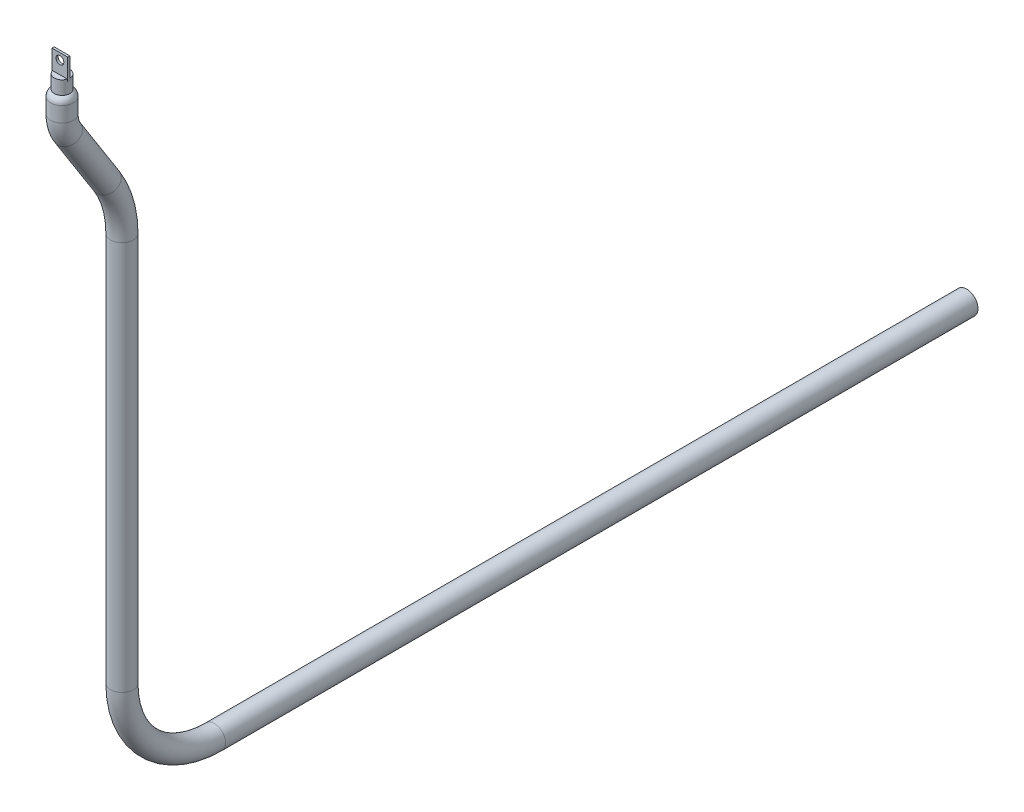
ISO-10303-21;
HEADER;
FILE_DESCRIPTION(('STEP AP214'),'2;1');
FILE_NAME('part.step','',(''),(''),'','','');
FILE_SCHEMA(('AUTOMOTIVE_DESIGN { 1 0 10303 214 1 1 1 1 }'));
ENDSEC;
DATA;
#1=APPLICATION_CONTEXT('core data for automotive mechanical design processes');
#2=APPLICATION_PROTOCOL_DEFINITION('international standard','automotive_design',2000,#1);
#3=PRODUCT_CONTEXT('',#1,'mechanical');
#4=PRODUCT('Part','Part','',(#3));
#5=PRODUCT_RELATED_PRODUCT_CATEGORY('part','',(#4));
#6=PRODUCT_DEFINITION_FORMATION('','',#4);
#7=PRODUCT_DEFINITION_CONTEXT('part definition',#1,'design');
#8=PRODUCT_DEFINITION('design','',#6,#7);
#9=PRODUCT_DEFINITION_SHAPE('','',#8);
#10=(LENGTH_UNIT() NAMED_UNIT(*) SI_UNIT(.MILLI.,.METRE.));
#11=(NAMED_UNIT(*) PLANE_ANGLE_UNIT() SI_UNIT($,.RADIAN.));
#12=(NAMED_UNIT(*) SI_UNIT($,.STERADIAN.) SOLID_ANGLE_UNIT());
#13=UNCERTAINTY_MEASURE_WITH_UNIT(LENGTH_MEASURE(1.E-05),#10,'distance_accuracy_value','');
#14=(GEOMETRIC_REPRESENTATION_CONTEXT(3) GLOBAL_UNCERTAINTY_ASSIGNED_CONTEXT((#13)) GLOBAL_UNIT_ASSIGNED_CONTEXT((#10,
#11,#12)) REPRESENTATION_CONTEXT('',''));
#15=CARTESIAN_POINT('',(0.,0.,0.));
#16=DIRECTION('',(0.,0.,1.));
#17=DIRECTION('',(1.,0.,0.));
#18=AXIS2_PLACEMENT_3D('',#15,#16,#17);
#19=CARTESIAN_POINT('',(-975.305963879187,-228.418485436412,3234.31000000033));
#20=DIRECTION('',(3.76669157220565E-13,-1.,0.));
#21=DIRECTION('',(1.,3.76669157220565E-13,0.));
#22=AXIS2_PLACEMENT_3D('',#19,#20,#21);
#23=CYLINDRICAL_SURFACE('',#22,10.8411087915801);
#24=CARTESIAN_POINT('',(-975.30596387918,-247.418485436412,3234.31000000033));
#25=DIRECTION('',(-3.76669157220565E-13,1.,0.));
#26=DIRECTION('',(-1.,-3.76669157220565E-13,0.));
#27=AXIS2_PLACEMENT_3D('',#24,#25,#26);
#28=CIRCLE('',#27,10.8411087915801);
#29=CARTESIAN_POINT('',(-986.14707267076,-247.418485436416,3234.31000000033));
#30=VERTEX_POINT('',#29);
#31=EDGE_CURVE('E151',#30,#30,#28,.T.);
#32=ORIENTED_EDGE('',*,*,#31,.T.);
#33=EDGE_LOOP('',(#32));
#34=FACE_BOUND('',#33,.T.);
#35=DIRECTION('',(3.76669157220565E-13,-1.,0.));
#36=VECTOR('',#35,1.);
#37=CARTESIAN_POINT('',(-964.888207890929,-228.418485436408,3237.31000000033));
#38=LINE('',#37,#36);
#39=CARTESIAN_POINT('',(-964.888207890929,-228.418485436408,3237.31000000033));
#40=VERTEX_POINT('',#39);
#41=CARTESIAN_POINT('',(-964.888207890928,-231.330473187857,3237.31000000033));
#42=VERTEX_POINT('',#41);
#43=EDGE_CURVE('E149',#40,#42,#38,.T.);
#44=ORIENTED_EDGE('',*,*,#43,.F.);
#45=CARTESIAN_POINT('',(-975.305963879187,-228.418485436412,3234.31000000033));
#46=DIRECTION('',(-3.76669157220565E-13,1.,0.));
#47=DIRECTION('',(-1.,-3.76669157220565E-13,0.));
#48=AXIS2_PLACEMENT_3D('',#45,#46,#47);
#49=CIRCLE('',#48,10.8411087915801);
#50=CARTESIAN_POINT('',(-985.723719867444,-228.418485436416,3237.31000000033));
#51=VERTEX_POINT('',#50);
#52=EDGE_CURVE('E154',#51,#40,#49,.T.);
#53=ORIENTED_EDGE('',*,*,#52,.F.);
#54=DIRECTION('',(3.76669157220565E-13,-1.,0.));
#55=VECTOR('',#54,1.);
#56=CARTESIAN_POINT('',(-985.723719867444,-228.418485436416,3237.31000000033));
#57=LINE('',#56,#55);
#58=CARTESIAN_POINT('',(-985.723719867443,-231.330473187857,3237.31000000033));
#59=VERTEX_POINT('',#58);
#60=EDGE_CURVE('E146',#59,#51,#57,.F.);
#61=ORIENTED_EDGE('',*,*,#60,.F.);
#62=CARTESIAN_POINT('',(-975.305963879186,-231.330473187857,3234.31000000033));
#63=DIRECTION('',(0.,1.,0.));
#64=DIRECTION('',(0.,0.,1.));
#65=AXIS2_PLACEMENT_3D('',#62,#63,#64);
#66=CIRCLE('',#65,10.8411087915801);
#67=CARTESIAN_POINT('',(-986.147072670766,-231.330473187857,3234.31000000033));
#68=VERTEX_POINT('',#67);
#69=EDGE_CURVE('E181',#68,#59,#66,.T.);
#70=ORIENTED_EDGE('',*,*,#69,.F.);
#71=DIRECTION('',(3.76669157220565E-13,-1.,0.));
#72=VECTOR('',#71,1.);
#73=CARTESIAN_POINT('',(-986.147072670767,-228.418485436416,3234.31000000033));
#74=LINE('',#73,#72);
#75=CARTESIAN_POINT('',(-986.147072670767,-228.418485436416,3234.31000000033));
#76=VERTEX_POINT('',#75);
#77=EDGE_CURVE('E137',#68,#76,#74,.F.);
#78=ORIENTED_EDGE('',*,*,#77,.T.);
#79=CARTESIAN_POINT('',(-964.464855087607,-228.418485436408,3234.31000000033));
#80=VERTEX_POINT('',#79);
#81=EDGE_CURVE('E152',#80,#76,#49,.T.);
#82=ORIENTED_EDGE('',*,*,#81,.F.);
#83=DIRECTION('',(3.76669157220565E-13,-1.,0.));
#84=VECTOR('',#83,1.);
#85=CARTESIAN_POINT('',(-964.464855087607,-228.418485436408,3234.31000000033));
#86=LINE('',#85,#84);
#87=CARTESIAN_POINT('',(-964.464855087606,-231.330473187857,3234.31000000033));
#88=VERTEX_POINT('',#87);
#89=EDGE_CURVE('E60',#80,#88,#86,.T.);
#90=ORIENTED_EDGE('',*,*,#89,.T.);
#91=EDGE_CURVE('E53',#42,#88,#66,.T.);
#92=ORIENTED_EDGE('',*,*,#91,.F.);
#93=EDGE_LOOP('',(#44,#53,#61,#70,#78,#82,#90,#92));
#94=FACE_BOUND('',#93,.T.);
#95=ADVANCED_FACE('F45',(#34,#94),#23,.T.);
#96=CARTESIAN_POINT('',(-975.305963879187,-228.418485436412,3234.31000000033));
#97=DIRECTION('',(-3.76669157220565E-13,1.,0.));
#98=DIRECTION('',(-1.,-3.76669157220565E-13,0.));
#99=AXIS2_PLACEMENT_3D('',#96,#97,#98);
#100=PLANE('',#99);
#101=ORIENTED_EDGE('',*,*,#52,.T.);
#102=DIRECTION('',(-1.,-3.76669157220565E-13,0.));
#103=VECTOR('',#102,1.);
#104=CARTESIAN_POINT('',(-975.305963879187,-228.418485436412,3237.31000000033));
#105=LINE('',#104,#103);
#106=EDGE_CURVE('E180',#40,#51,#105,.T.);
#107=ORIENTED_EDGE('',*,*,#106,.T.);
#108=EDGE_LOOP('',(#101,#107));
#109=FACE_BOUND('',#108,.T.);
#110=ADVANCED_FACE('F225',(#109),#100,.T.);
#111=CARTESIAN_POINT('',(-975.30596387918,-1144.03551161771,1960.49717849321));
#112=DIRECTION('',(0.,0.,1.));
#113=DIRECTION('',(1.,0.,0.));
#114=AXIS2_PLACEMENT_3D('',#111,#112,#113);
#115=PLANE('',#114);
#116=CARTESIAN_POINT('',(-975.30596387918,-1144.03551161771,1960.49717849321));
#117=DIRECTION('',(0.,0.,1.));
#118=DIRECTION('',(1.,0.,0.));
#119=AXIS2_PLACEMENT_3D('',#116,#117,#118);
#120=CIRCLE('',#119,16.);
#121=CARTESIAN_POINT('',(-959.30596387918,-1144.03551161771,1960.49717849321));
#122=VERTEX_POINT('',#121);
#123=EDGE_CURVE('E175',#122,#122,#120,.T.);
#124=ORIENTED_EDGE('',*,*,#123,.F.);
#125=EDGE_LOOP('',(#124));
#126=FACE_BOUND('',#125,.T.);
#127=ADVANCED_FACE('F231',(#126),#115,.F.);
#128=CARTESIAN_POINT('',(-975.30596387918,-247.418485436045,3234.31000000033));
#129=DIRECTION('',(0.,-1.,0.));
#130=DIRECTION('',(0.,0.,-1.));
#131=AXIS2_PLACEMENT_3D('',#128,#129,#130);
#132=CYLINDRICAL_SURFACE('',#131,16.);
#133=CARTESIAN_POINT('',(-975.30596387918,-256.168552045396,3234.31000000033));
#134=DIRECTION('',(0.,1.,0.));
#135=DIRECTION('',(0.,0.,1.));
#136=AXIS2_PLACEMENT_3D('',#133,#134,#135);
#137=CIRCLE('',#136,16.);
#138=CARTESIAN_POINT('',(-975.30596387918,-256.168552045396,3250.31000000033));
#139=VERTEX_POINT('',#138);
#140=EDGE_CURVE('E12',#139,#139,#137,.F.);
#141=ORIENTED_EDGE('',*,*,#140,.T.);
#142=EDGE_LOOP('',(#141));
#143=FACE_BOUND('',#142,.T.);
#144=CARTESIAN_POINT('',(-975.30596387918,-277.482733156082,3234.31000000033));
#145=DIRECTION('',(0.,1.,0.));
#146=DIRECTION('',(1.,0.,0.));
#147=AXIS2_PLACEMENT_3D('',#144,#145,#146);
#148=CIRCLE('',#147,16.);
#149=CARTESIAN_POINT('',(-975.30596387918,-277.482733156082,3250.31000000033));
#150=VERTEX_POINT('',#149);
#151=EDGE_CURVE('E157',#150,#150,#148,.T.);
#152=ORIENTED_EDGE('',*,*,#151,.T.);
#153=EDGE_LOOP('',(#152));
#154=FACE_BOUND('',#153,.T.);
#155=ADVANCED_FACE('F238',(#143,#154),#132,.T.);
#156=CARTESIAN_POINT('',(-975.30596387918,-277.482733156082,3184.31000000033));
#157=DIRECTION('',(1.,0.,0.));
#158=DIRECTION('',(0.,0.,-1.));
#159=AXIS2_PLACEMENT_3D('',#156,#157,#158);
#160=TOROIDAL_SURFACE('',#159,49.9999999999998,16.);
#161=CARTESIAN_POINT('',(-975.30596387918,-304.277730702825,3226.52407474407));
#162=DIRECTION('',(0.,0.844281494874783,0.535899950934875));
#163=DIRECTION('',(1.,0.,0.));
#164=AXIS2_PLACEMENT_3D('',#161,#162,#163);
#165=CIRCLE('',#164,16.);
#166=CARTESIAN_POINT('',(-975.30596387918,-312.852129917783,3240.03257866206));
#167=VERTEX_POINT('',#166);
#168=EDGE_CURVE('E160',#167,#167,#165,.T.);
#169=CARTESIAN_POINT('',(-975.30596387918,-277.482733156082,3184.31000000033));
#170=DIRECTION('',(1.,0.,0.));
#171=DIRECTION('',(0.,0.,-1.));
#172=AXIS2_PLACEMENT_3D('',#169,#170,#171);
#173=CIRCLE('',#172,65.9999999999998);
#174=EDGE_CURVE('',#150,#167,#173,.T.);
#175=ORIENTED_EDGE('',*,*,#151,.F.);
#176=ORIENTED_EDGE('',*,*,#168,.T.);
#177=ORIENTED_EDGE('',*,*,#174,.T.);
#178=ORIENTED_EDGE('',*,*,#174,.F.);
#179=EDGE_LOOP('',(#175,#177,#176,#178));
#180=FACE_BOUND('',#179,.T.);
#181=ADVANCED_FACE('F241',(#180),#160,.T.);
#182=CARTESIAN_POINT('',(-975.30596387918,-304.277730702825,3226.52407474407));
#183=DIRECTION('',(0.,-0.844281494874781,-0.535899950934878));
#184=DIRECTION('',(0.,0.535899950934878,-0.844281494874781));
#185=AXIS2_PLACEMENT_3D('',#182,#183,#184);
#186=CYLINDRICAL_SURFACE('',#185,16.);
#187=CARTESIAN_POINT('',(-975.30596387918,-390.490454438682,3171.80133748111));
#188=DIRECTION('',(0.,0.844281494874781,0.535899950934878));
#189=DIRECTION('',(1.,0.,0.));
#190=AXIS2_PLACEMENT_3D('',#187,#188,#189);
#191=CIRCLE('',#190,16.);
#192=CARTESIAN_POINT('',(-975.30596387918,-381.916055223724,3158.29283356312));
#193=VERTEX_POINT('',#192);
#194=EDGE_CURVE('E163',#193,#193,#191,.T.);
#195=ORIENTED_EDGE('',*,*,#194,.T.);
#196=EDGE_LOOP('',(#195));
#197=FACE_BOUND('',#196,.T.);
#198=ORIENTED_EDGE('',*,*,#168,.F.);
#199=EDGE_LOOP('',(#198));
#200=FACE_BOUND('',#199,.T.);
#201=ADVANCED_FACE('F245',(#197,#200),#186,.T.);
#202=CARTESIAN_POINT('',(-975.30596387918,-465.516447569564,3290.00074676358));
#203=DIRECTION('',(-1.,0.,0.));
#204=DIRECTION('',(0.,0.,1.));
#205=AXIS2_PLACEMENT_3D('',#202,#203,#204);
#206=TOROIDAL_SURFACE('',#205,140.,16.);
#207=CARTESIAN_POINT('',(-975.30596387918,-465.516447569565,3150.00074676358));
#208=DIRECTION('',(0.,1.,0.));
#209=DIRECTION('',(1.,0.,0.));
#210=AXIS2_PLACEMENT_3D('',#207,#208,#209);
#211=CIRCLE('',#210,16.);
#212=CARTESIAN_POINT('',(-975.30596387918,-465.516447569565,3134.00074676358));
#213=VERTEX_POINT('',#212);
#214=EDGE_CURVE('E166',#213,#213,#211,.T.);
#215=CARTESIAN_POINT('',(-975.30596387918,-465.516447569564,3290.00074676358));
#216=DIRECTION('',(-1.,0.,0.));
#217=DIRECTION('',(0.,0.,1.));
#218=AXIS2_PLACEMENT_3D('',#215,#216,#217);
#219=CIRCLE('',#218,156.);
#220=EDGE_CURVE('',#193,#213,#219,.T.);
#221=ORIENTED_EDGE('',*,*,#194,.F.);
#222=ORIENTED_EDGE('',*,*,#214,.T.);
#223=ORIENTED_EDGE('',*,*,#220,.T.);
#224=ORIENTED_EDGE('',*,*,#220,.F.);
#225=EDGE_LOOP('',(#221,#223,#222,#224));
#226=FACE_BOUND('',#225,.T.);
#227=ADVANCED_FACE('F249',(#226),#206,.T.);
#228=CARTESIAN_POINT('',(-975.30596387918,-465.516447569565,3150.00074676358));
#229=DIRECTION('',(0.,-1.,0.));
#230=DIRECTION('',(0.,0.,-1.));
#231=AXIS2_PLACEMENT_3D('',#228,#229,#230);
#232=CYLINDRICAL_SURFACE('',#231,16.);
#233=CARTESIAN_POINT('',(-975.30596387918,-1014.03551161771,3150.00074676358));
#234=DIRECTION('',(0.,1.,0.));
#235=DIRECTION('',(1.,0.,0.));
#236=AXIS2_PLACEMENT_3D('',#233,#234,#235);
#237=CIRCLE('',#236,16.);
#238=CARTESIAN_POINT('',(-975.30596387918,-1014.03551161771,3166.00074676358));
#239=VERTEX_POINT('',#238);
#240=EDGE_CURVE('E169',#239,#239,#237,.T.);
#241=ORIENTED_EDGE('',*,*,#240,.T.);
#242=EDGE_LOOP('',(#241));
#243=FACE_BOUND('',#242,.T.);
#244=ORIENTED_EDGE('',*,*,#214,.F.);
#245=EDGE_LOOP('',(#244));
#246=FACE_BOUND('',#245,.T.);
#247=ADVANCED_FACE('F253',(#243,#246),#232,.T.);
#248=CARTESIAN_POINT('',(-975.30596387918,-1014.03551161771,3020.00074676358));
#249=DIRECTION('',(1.,0.,0.));
#250=DIRECTION('',(0.,0.,-1.));
#251=AXIS2_PLACEMENT_3D('',#248,#249,#250);
#252=TOROIDAL_SURFACE('',#251,130.,16.);
#253=CARTESIAN_POINT('',(-975.30596387918,-1144.03551161771,3020.00074676358));
#254=DIRECTION('',(0.,0.,1.));
#255=DIRECTION('',(1.,0.,0.));
#256=AXIS2_PLACEMENT_3D('',#253,#254,#255);
#257=CIRCLE('',#256,16.);
#258=CARTESIAN_POINT('',(-975.30596387918,-1160.03551161771,3020.00074676358));
#259=VERTEX_POINT('',#258);
#260=EDGE_CURVE('E172',#259,#259,#257,.T.);
#261=CARTESIAN_POINT('',(-975.30596387918,-1014.03551161771,3020.00074676358));
#262=DIRECTION('',(1.,0.,0.));
#263=DIRECTION('',(0.,0.,-1.));
#264=AXIS2_PLACEMENT_3D('',#261,#262,#263);
#265=CIRCLE('',#264,146.);
#266=EDGE_CURVE('',#239,#259,#265,.T.);
#267=ORIENTED_EDGE('',*,*,#240,.F.);
#268=ORIENTED_EDGE('',*,*,#260,.T.);
#269=ORIENTED_EDGE('',*,*,#266,.T.);
#270=ORIENTED_EDGE('',*,*,#266,.F.);
#271=EDGE_LOOP('',(#267,#269,#268,#270));
#272=FACE_BOUND('',#271,.T.);
#273=ADVANCED_FACE('F257',(#272),#252,.T.);
#274=CARTESIAN_POINT('',(-975.30596387918,-1144.03551161771,3020.00074676358));
#275=DIRECTION('',(0.,0.,-1.));
#276=DIRECTION('',(-1.,0.,0.));
#277=AXIS2_PLACEMENT_3D('',#274,#275,#276);
#278=CYLINDRICAL_SURFACE('',#277,16.);
#279=ORIENTED_EDGE('',*,*,#123,.T.);
#280=EDGE_LOOP('',(#279));
#281=FACE_BOUND('',#280,.T.);
#282=ORIENTED_EDGE('',*,*,#260,.F.);
#283=EDGE_LOOP('',(#282));
#284=FACE_BOUND('',#283,.T.);
#285=ADVANCED_FACE('F235',(#281,#284),#278,.T.);
#286=DIRECTION('',(-1.,-3.76669157220565E-13,0.));
#287=VECTOR('',#286,1.);
#288=CARTESIAN_POINT('',(-975.305963879187,-228.418485436412,3234.31000000033));
#289=LINE('',#288,#287);
#290=EDGE_CURVE('E177',#80,#76,#289,.T.);
#291=ORIENTED_EDGE('',*,*,#290,.F.);
#292=ORIENTED_EDGE('',*,*,#81,.T.);
#293=EDGE_LOOP('',(#291,#292));
#294=FACE_BOUND('',#293,.T.);
#295=ADVANCED_FACE('F234',(#294),#100,.T.);
#296=CARTESIAN_POINT('',(-986.30596387918,-231.330473187857,3237.31000000033));
#297=DIRECTION('',(0.,1.,0.));
#298=DIRECTION('',(0.,0.,1.));
#299=AXIS2_PLACEMENT_3D('',#296,#297,#298);
#300=PLANE('',#299);
#301=DIRECTION('',(1.,0.,0.));
#302=VECTOR('',#301,1.);
#303=CARTESIAN_POINT('',(-986.30596387918,-231.330473187857,3237.31000000033));
#304=LINE('',#303,#302);
#305=CARTESIAN_POINT('',(-964.30596387918,-231.330473187857,3237.31000000033));
#306=VERTEX_POINT('',#305);
#307=EDGE_CURVE('E128',#42,#306,#304,.T.);
#308=ORIENTED_EDGE('',*,*,#307,.F.);
#309=ORIENTED_EDGE('',*,*,#91,.T.);
#310=DIRECTION('',(1.,0.,0.));
#311=VECTOR('',#310,1.);
#312=CARTESIAN_POINT('',(-986.30596387918,-231.330473187857,3234.31000000033));
#313=LINE('',#312,#311);
#314=CARTESIAN_POINT('',(-964.30596387918,-231.330473187857,3234.31000000033));
#315=VERTEX_POINT('',#314);
#316=EDGE_CURVE('E190',#88,#315,#313,.T.);
#317=ORIENTED_EDGE('',*,*,#316,.T.);
#318=DIRECTION('',(0.,0.,-1.));
#319=VECTOR('',#318,1.);
#320=CARTESIAN_POINT('',(-964.30596387918,-231.330473187857,3237.31000000033));
#321=LINE('',#320,#319);
#322=EDGE_CURVE('E199',#306,#315,#321,.T.);
#323=ORIENTED_EDGE('',*,*,#322,.F.);
#324=EDGE_LOOP('',(#308,#309,#317,#323));
#325=FACE_BOUND('',#324,.T.);
#326=ADVANCED_FACE('F189',(#325),#300,.F.);
#327=CARTESIAN_POINT('',(0.,0.,3237.31000000033));
#328=DIRECTION('',(0.,0.,-1.));
#329=DIRECTION('',(-1.,0.,0.));
#330=AXIS2_PLACEMENT_3D('',#327,#328,#329);
#331=PLANE('',#330);
#332=CARTESIAN_POINT('',(-975.30596387918,-210.525068536037,3237.31000000033));
#333=DIRECTION('',(0.,0.,1.));
#334=DIRECTION('',(1.,0.,0.));
#335=AXIS2_PLACEMENT_3D('',#332,#333,#334);
#336=CIRCLE('',#335,5.49999999998371);
#337=CARTESIAN_POINT('',(-969.805963879196,-210.525068536037,3237.31000000033));
#338=VERTEX_POINT('',#337);
#339=EDGE_CURVE('E213',#338,#338,#336,.T.);
#340=ORIENTED_EDGE('',*,*,#339,.F.);
#341=EDGE_LOOP('',(#340));
#342=FACE_BOUND('',#341,.T.);
#343=ORIENTED_EDGE('',*,*,#106,.F.);
#344=ORIENTED_EDGE('',*,*,#43,.T.);
#345=ORIENTED_EDGE('',*,*,#307,.T.);
#346=DIRECTION('',(0.,1.,0.));
#347=VECTOR('',#346,1.);
#348=CARTESIAN_POINT('',(-964.30596387918,-231.330473187857,3237.31000000033));
#349=LINE('',#348,#347);
#350=CARTESIAN_POINT('',(-964.30596387918,-201.330473187857,3237.31000000033));
#351=VERTEX_POINT('',#350);
#352=EDGE_CURVE('E122',#306,#351,#349,.T.);
#353=ORIENTED_EDGE('',*,*,#352,.T.);
#354=DIRECTION('',(-1.,0.,0.));
#355=VECTOR('',#354,1.);
#356=CARTESIAN_POINT('',(-986.30596387918,-201.330473187857,3237.31000000033));
#357=LINE('',#356,#355);
#358=CARTESIAN_POINT('',(-986.30596387918,-201.330473187857,3237.31000000033));
#359=VERTEX_POINT('',#358);
#360=EDGE_CURVE('E111',#351,#359,#357,.T.);
#361=ORIENTED_EDGE('',*,*,#360,.T.);
#362=DIRECTION('',(0.,-1.,0.));
#363=VECTOR('',#362,1.);
#364=CARTESIAN_POINT('',(-986.30596387918,-231.330473187857,3237.31000000033));
#365=LINE('',#364,#363);
#366=CARTESIAN_POINT('',(-986.30596387918,-231.330473187857,3237.31000000033));
#367=VERTEX_POINT('',#366);
#368=EDGE_CURVE('E121',#359,#367,#365,.T.);
#369=ORIENTED_EDGE('',*,*,#368,.T.);
#370=EDGE_CURVE('E200',#367,#59,#304,.T.);
#371=ORIENTED_EDGE('',*,*,#370,.T.);
#372=ORIENTED_EDGE('',*,*,#60,.T.);
#373=EDGE_LOOP('',(#343,#344,#345,#353,#361,#369,#371,#372));
#374=FACE_BOUND('',#373,.T.);
#375=ADVANCED_FACE('F126',(#342,#374),#331,.F.);
#376=CARTESIAN_POINT('',(0.,0.,3234.31000000033));
#377=DIRECTION('',(0.,0.,-1.));
#378=DIRECTION('',(-1.,0.,0.));
#379=AXIS2_PLACEMENT_3D('',#376,#377,#378);
#380=PLANE('',#379);
#381=CARTESIAN_POINT('',(-975.30596387918,-210.525068536037,3234.31000000033));
#382=DIRECTION('',(0.,0.,1.));
#383=DIRECTION('',(1.,0.,0.));
#384=AXIS2_PLACEMENT_3D('',#381,#382,#383);
#385=CIRCLE('',#384,5.49999999998371);
#386=CARTESIAN_POINT('',(-969.805963879196,-210.525068536037,3234.31000000033));
#387=VERTEX_POINT('',#386);
#388=EDGE_CURVE('E294',#387,#387,#385,.T.);
#389=ORIENTED_EDGE('',*,*,#388,.T.);
#390=EDGE_LOOP('',(#389));
#391=FACE_BOUND('',#390,.T.);
#392=ORIENTED_EDGE('',*,*,#89,.F.);
#393=ORIENTED_EDGE('',*,*,#290,.T.);
#394=ORIENTED_EDGE('',*,*,#77,.F.);
#395=CARTESIAN_POINT('',(-986.30596387918,-231.330473187857,3234.31000000033));
#396=VERTEX_POINT('',#395);
#397=EDGE_CURVE('E132',#396,#68,#313,.T.);
#398=ORIENTED_EDGE('',*,*,#397,.F.);
#399=DIRECTION('',(0.,-1.,0.));
#400=VECTOR('',#399,1.);
#401=CARTESIAN_POINT('',(-986.30596387918,-231.330473187857,3234.31000000033));
#402=LINE('',#401,#400);
#403=CARTESIAN_POINT('',(-986.30596387918,-201.330473187857,3234.31000000033));
#404=VERTEX_POINT('',#403);
#405=EDGE_CURVE('E193',#404,#396,#402,.T.);
#406=ORIENTED_EDGE('',*,*,#405,.F.);
#407=DIRECTION('',(-1.,0.,0.));
#408=VECTOR('',#407,1.);
#409=CARTESIAN_POINT('',(-986.30596387918,-201.330473187857,3234.31000000033));
#410=LINE('',#409,#408);
#411=CARTESIAN_POINT('',(-964.30596387918,-201.330473187857,3234.31000000033));
#412=VERTEX_POINT('',#411);
#413=EDGE_CURVE('E195',#412,#404,#410,.T.);
#414=ORIENTED_EDGE('',*,*,#413,.F.);
#415=DIRECTION('',(0.,1.,0.));
#416=VECTOR('',#415,1.);
#417=CARTESIAN_POINT('',(-964.30596387918,-231.330473187857,3234.31000000033));
#418=LINE('',#417,#416);
#419=EDGE_CURVE('E136',#315,#412,#418,.T.);
#420=ORIENTED_EDGE('',*,*,#419,.F.);
#421=ORIENTED_EDGE('',*,*,#316,.F.);
#422=EDGE_LOOP('',(#392,#393,#394,#398,#406,#414,#420,#421));
#423=FACE_BOUND('',#422,.T.);
#424=ADVANCED_FACE('F192',(#391,#423),#380,.T.);
#425=CARTESIAN_POINT('',(-964.30596387918,-231.330473187857,3237.31000000033));
#426=DIRECTION('',(-1.,0.,0.));
#427=DIRECTION('',(0.,0.,1.));
#428=AXIS2_PLACEMENT_3D('',#425,#426,#427);
#429=PLANE('',#428);
#430=ORIENTED_EDGE('',*,*,#419,.T.);
#431=DIRECTION('',(0.,0.,-1.));
#432=VECTOR('',#431,1.);
#433=CARTESIAN_POINT('',(-964.30596387918,-201.330473187857,3237.31000000033));
#434=LINE('',#433,#432);
#435=EDGE_CURVE('E115',#351,#412,#434,.T.);
#436=ORIENTED_EDGE('',*,*,#435,.F.);
#437=ORIENTED_EDGE('',*,*,#352,.F.);
#438=ORIENTED_EDGE('',*,*,#322,.T.);
#439=EDGE_LOOP('',(#430,#436,#437,#438));
#440=FACE_BOUND('',#439,.T.);
#441=ADVANCED_FACE('F134',(#440),#429,.F.);
#442=CARTESIAN_POINT('',(-986.30596387918,-201.330473187857,3237.31000000033));
#443=DIRECTION('',(0.,-1.,0.));
#444=DIRECTION('',(0.,0.,-1.));
#445=AXIS2_PLACEMENT_3D('',#442,#443,#444);
#446=PLANE('',#445);
#447=ORIENTED_EDGE('',*,*,#413,.T.);
#448=DIRECTION('',(0.,0.,-1.));
#449=VECTOR('',#448,1.);
#450=CARTESIAN_POINT('',(-986.30596387918,-201.330473187857,3237.31000000033));
#451=LINE('',#450,#449);
#452=EDGE_CURVE('E118',#359,#404,#451,.T.);
#453=ORIENTED_EDGE('',*,*,#452,.F.);
#454=ORIENTED_EDGE('',*,*,#360,.F.);
#455=ORIENTED_EDGE('',*,*,#435,.T.);
#456=EDGE_LOOP('',(#447,#453,#454,#455));
#457=FACE_BOUND('',#456,.T.);
#458=ADVANCED_FACE('F113',(#457),#446,.F.);
#459=CARTESIAN_POINT('',(-986.30596387918,-231.330473187857,3237.31000000033));
#460=DIRECTION('',(1.,0.,0.));
#461=DIRECTION('',(0.,0.,-1.));
#462=AXIS2_PLACEMENT_3D('',#459,#460,#461);
#463=PLANE('',#462);
#464=ORIENTED_EDGE('',*,*,#405,.T.);
#465=DIRECTION('',(0.,0.,-1.));
#466=VECTOR('',#465,1.);
#467=CARTESIAN_POINT('',(-986.30596387918,-231.330473187857,3237.31000000033));
#468=LINE('',#467,#466);
#469=EDGE_CURVE('E141',#367,#396,#468,.T.);
#470=ORIENTED_EDGE('',*,*,#469,.F.);
#471=ORIENTED_EDGE('',*,*,#368,.F.);
#472=ORIENTED_EDGE('',*,*,#452,.T.);
#473=EDGE_LOOP('',(#464,#470,#471,#472));
#474=FACE_BOUND('',#473,.T.);
#475=ADVANCED_FACE('F214',(#474),#463,.F.);
#476=ORIENTED_EDGE('',*,*,#397,.T.);
#477=ORIENTED_EDGE('',*,*,#69,.T.);
#478=ORIENTED_EDGE('',*,*,#370,.F.);
#479=ORIENTED_EDGE('',*,*,#469,.T.);
#480=EDGE_LOOP('',(#476,#477,#478,#479));
#481=FACE_BOUND('',#480,.T.);
#482=ADVANCED_FACE('F204',(#481),#300,.F.);
#483=CARTESIAN_POINT('',(-975.30596387918,-210.525068536037,3237.31000000033));
#484=DIRECTION('',(0.,0.,-1.));
#485=DIRECTION('',(-1.,0.,0.));
#486=AXIS2_PLACEMENT_3D('',#483,#484,#485);
#487=CYLINDRICAL_SURFACE('',#486,5.49999999998371);
#488=ORIENTED_EDGE('',*,*,#339,.T.);
#489=EDGE_LOOP('',(#488));
#490=FACE_BOUND('',#489,.T.);
#491=ORIENTED_EDGE('',*,*,#388,.F.);
#492=EDGE_LOOP('',(#491));
#493=FACE_BOUND('',#492,.T.);
#494=ADVANCED_FACE('F221',(#490,#493),#487,.F.);
#495=CARTESIAN_POINT('',(-975.30596387918,-256.168552045396,3234.31000000033));
#496=DIRECTION('',(0.,1.,0.));
#497=DIRECTION('',(0.,0.,1.));
#498=AXIS2_PLACEMENT_3D('',#495,#496,#497);
#499=DEGENERATE_TOROIDAL_SURFACE('',#498,6.00000000000001,10.,.T.);
#500=ORIENTED_EDGE('',*,*,#140,.F.);
#501=EDGE_LOOP('',(#500));
#502=FACE_BOUND('',#501,.T.);
#503=ORIENTED_EDGE('',*,*,#31,.F.);
#504=EDGE_LOOP('',(#503));
#505=FACE_BOUND('',#504,.T.);
#506=ADVANCED_FACE('F47',(#502,#505),#499,.T.);
#507=CLOSED_SHELL('',(#95,#110,#127,#155,#181,#201,#227,#247,#273,#285,#295,#326,#375,#424,#441,
#458,#475,#482,#494,#506));
#508=MANIFOLD_SOLID_BREP('B2',#507);
#509=ADVANCED_BREP_SHAPE_REPRESENTATION('',(#18,#508),#14);
#510=SHAPE_DEFINITION_REPRESENTATION(#9,#509);
ENDSEC;
END-ISO-10303-21;
